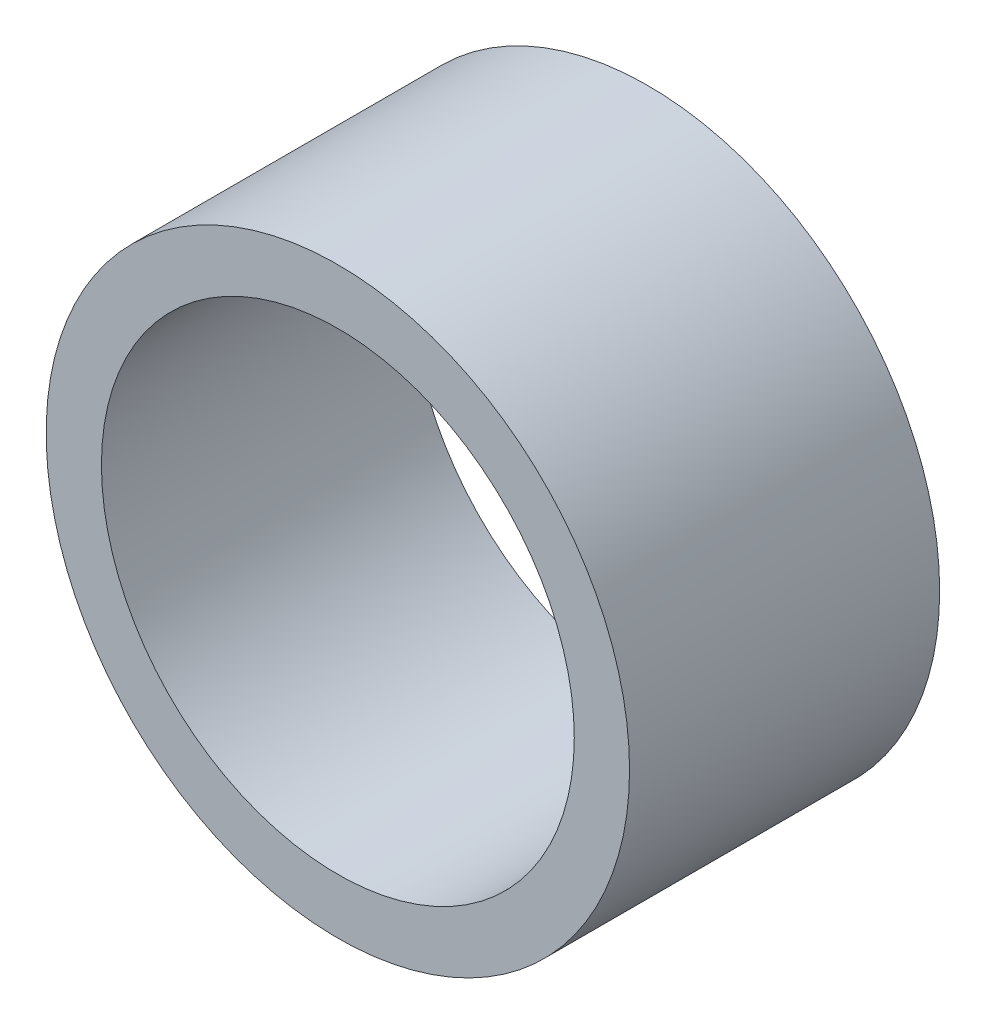
ISO-10303-21;
HEADER;
FILE_DESCRIPTION(('STEP AP214'),'2;1');
FILE_NAME('part.step','',(''),(''),'','','');
FILE_SCHEMA(('AUTOMOTIVE_DESIGN { 1 0 10303 214 1 1 1 1 }'));
ENDSEC;
DATA;
#1=APPLICATION_CONTEXT('core data for automotive mechanical design processes');
#2=APPLICATION_PROTOCOL_DEFINITION('international standard','automotive_design',2000,#1);
#3=PRODUCT_CONTEXT('',#1,'mechanical');
#4=PRODUCT('Part','Part','',(#3));
#5=PRODUCT_RELATED_PRODUCT_CATEGORY('part','',(#4));
#6=PRODUCT_DEFINITION_FORMATION('','',#4);
#7=PRODUCT_DEFINITION_CONTEXT('part definition',#1,'design');
#8=PRODUCT_DEFINITION('design','',#6,#7);
#9=PRODUCT_DEFINITION_SHAPE('','',#8);
#10=(LENGTH_UNIT() NAMED_UNIT(*) SI_UNIT(.MILLI.,.METRE.));
#11=(NAMED_UNIT(*) PLANE_ANGLE_UNIT() SI_UNIT($,.RADIAN.));
#12=(NAMED_UNIT(*) SI_UNIT($,.STERADIAN.) SOLID_ANGLE_UNIT());
#13=UNCERTAINTY_MEASURE_WITH_UNIT(LENGTH_MEASURE(1.E-05),#10,'distance_accuracy_value','');
#14=(GEOMETRIC_REPRESENTATION_CONTEXT(3) GLOBAL_UNCERTAINTY_ASSIGNED_CONTEXT((#13)) GLOBAL_UNIT_ASSIGNED_CONTEXT((#10,
#11,#12)) REPRESENTATION_CONTEXT('',''));
#15=CARTESIAN_POINT('',(0.,0.,0.));
#16=DIRECTION('',(0.,0.,1.));
#17=DIRECTION('',(1.,0.,0.));
#18=AXIS2_PLACEMENT_3D('',#15,#16,#17);
#19=CARTESIAN_POINT('',(0.,0.,-10.1));
#20=DIRECTION('',(0.,0.,1.));
#21=DIRECTION('',(1.,0.,0.));
#22=AXIS2_PLACEMENT_3D('',#19,#20,#21);
#23=CYLINDRICAL_SURFACE('',#22,9.5);
#24=CARTESIAN_POINT('',(0.,0.,-10.1));
#25=DIRECTION('',(0.,0.,1.));
#26=DIRECTION('',(1.,0.,0.));
#27=AXIS2_PLACEMENT_3D('',#24,#25,#26);
#28=CIRCLE('',#27,9.5);
#29=CARTESIAN_POINT('',(9.5,0.,-10.1));
#30=VERTEX_POINT('',#29);
#31=EDGE_CURVE('E10',#30,#30,#28,.T.);
#32=ORIENTED_EDGE('',*,*,#31,.T.);
#33=EDGE_LOOP('',(#32));
#34=FACE_BOUND('',#33,.T.);
#35=CARTESIAN_POINT('',(0.,0.,0.));
#36=DIRECTION('',(0.,0.,1.));
#37=DIRECTION('',(1.,0.,0.));
#38=AXIS2_PLACEMENT_3D('',#35,#36,#37);
#39=CIRCLE('',#38,9.5);
#40=CARTESIAN_POINT('',(9.5,0.,0.));
#41=VERTEX_POINT('',#40);
#42=EDGE_CURVE('E40',#41,#41,#39,.T.);
#43=ORIENTED_EDGE('',*,*,#42,.F.);
#44=EDGE_LOOP('',(#43));
#45=FACE_BOUND('',#44,.T.);
#46=ADVANCED_FACE('F37',(#34,#45),#23,.T.);
#47=CARTESIAN_POINT('',(0.,0.,-10.1));
#48=DIRECTION('',(0.,0.,1.));
#49=DIRECTION('',(1.,0.,0.));
#50=AXIS2_PLACEMENT_3D('',#47,#48,#49);
#51=PLANE('',#50);
#52=CARTESIAN_POINT('',(0.,0.,-10.1));
#53=DIRECTION('',(0.,0.,1.));
#54=DIRECTION('',(1.,0.,0.));
#55=AXIS2_PLACEMENT_3D('',#52,#53,#54);
#56=CIRCLE('',#55,7.7);
#57=CARTESIAN_POINT('',(7.7,0.,-10.1));
#58=VERTEX_POINT('',#57);
#59=EDGE_CURVE('E47',#58,#58,#56,.T.);
#60=ORIENTED_EDGE('',*,*,#59,.T.);
#61=EDGE_LOOP('',(#60));
#62=FACE_BOUND('',#61,.T.);
#63=ORIENTED_EDGE('',*,*,#31,.F.);
#64=EDGE_LOOP('',(#63));
#65=FACE_BOUND('',#64,.T.);
#66=ADVANCED_FACE('F55',(#62,#65),#51,.F.);
#67=CARTESIAN_POINT('',(0.,0.,0.));
#68=DIRECTION('',(0.,0.,1.));
#69=DIRECTION('',(1.,0.,0.));
#70=AXIS2_PLACEMENT_3D('',#67,#68,#69);
#71=PLANE('',#70);
#72=CARTESIAN_POINT('',(0.,0.,0.));
#73=DIRECTION('',(0.,0.,1.));
#74=DIRECTION('',(1.,0.,0.));
#75=AXIS2_PLACEMENT_3D('',#72,#73,#74);
#76=CIRCLE('',#75,7.7);
#77=CARTESIAN_POINT('',(7.7,0.,0.));
#78=VERTEX_POINT('',#77);
#79=EDGE_CURVE('E49',#78,#78,#76,.T.);
#80=ORIENTED_EDGE('',*,*,#79,.F.);
#81=EDGE_LOOP('',(#80));
#82=FACE_BOUND('',#81,.T.);
#83=ORIENTED_EDGE('',*,*,#42,.T.);
#84=EDGE_LOOP('',(#83));
#85=FACE_BOUND('',#84,.T.);
#86=ADVANCED_FACE('F61',(#82,#85),#71,.T.);
#87=CARTESIAN_POINT('',(0.,0.,-10.1));
#88=DIRECTION('',(0.,0.,1.));
#89=DIRECTION('',(1.,0.,0.));
#90=AXIS2_PLACEMENT_3D('',#87,#88,#89);
#91=CYLINDRICAL_SURFACE('',#90,7.7);
#92=ORIENTED_EDGE('',*,*,#59,.F.);
#93=EDGE_LOOP('',(#92));
#94=FACE_BOUND('',#93,.T.);
#95=ORIENTED_EDGE('',*,*,#79,.T.);
#96=EDGE_LOOP('',(#95));
#97=FACE_BOUND('',#96,.T.);
#98=ADVANCED_FACE('F58',(#94,#97),#91,.F.);
#99=CLOSED_SHELL('',(#46,#66,#86,#98));
#100=MANIFOLD_SOLID_BREP('B2',#99);
#101=ADVANCED_BREP_SHAPE_REPRESENTATION('',(#18,#100),#14);
#102=SHAPE_DEFINITION_REPRESENTATION(#9,#101);
ENDSEC;
END-ISO-10303-21;
